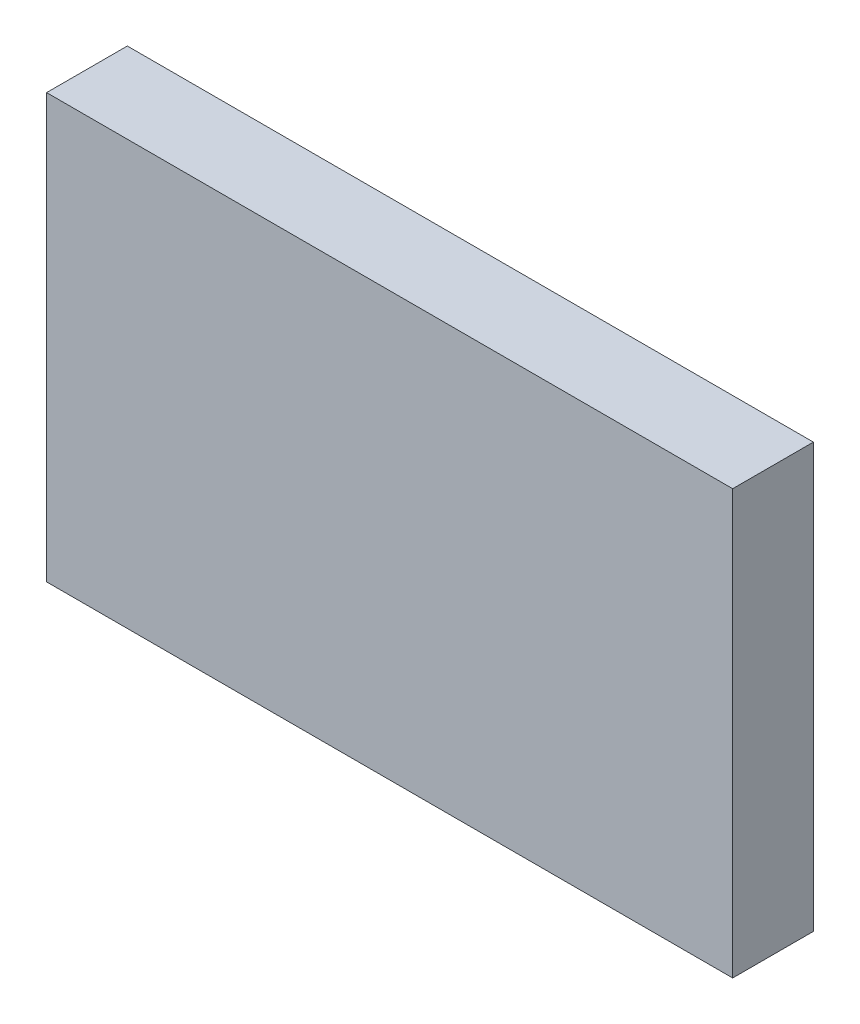
ISO-10303-21;
HEADER;
FILE_DESCRIPTION(('STEP AP214'),'2;1');
FILE_NAME('part.step','',(''),(''),'','','');
FILE_SCHEMA(('AUTOMOTIVE_DESIGN { 1 0 10303 214 1 1 1 1 }'));
ENDSEC;
DATA;
#1=APPLICATION_CONTEXT('core data for automotive mechanical design processes');
#2=APPLICATION_PROTOCOL_DEFINITION('international standard','automotive_design',2000,#1);
#3=PRODUCT_CONTEXT('',#1,'mechanical');
#4=PRODUCT('Part','Part','',(#3));
#5=PRODUCT_RELATED_PRODUCT_CATEGORY('part','',(#4));
#6=PRODUCT_DEFINITION_FORMATION('','',#4);
#7=PRODUCT_DEFINITION_CONTEXT('part definition',#1,'design');
#8=PRODUCT_DEFINITION('design','',#6,#7);
#9=PRODUCT_DEFINITION_SHAPE('','',#8);
#10=(LENGTH_UNIT() NAMED_UNIT(*) SI_UNIT(.MILLI.,.METRE.));
#11=(NAMED_UNIT(*) PLANE_ANGLE_UNIT() SI_UNIT($,.RADIAN.));
#12=(NAMED_UNIT(*) SI_UNIT($,.STERADIAN.) SOLID_ANGLE_UNIT());
#13=UNCERTAINTY_MEASURE_WITH_UNIT(LENGTH_MEASURE(1.E-05),#10,'distance_accuracy_value','');
#14=(GEOMETRIC_REPRESENTATION_CONTEXT(3) GLOBAL_UNCERTAINTY_ASSIGNED_CONTEXT((#13)) GLOBAL_UNIT_ASSIGNED_CONTEXT((#10,
#11,#12)) REPRESENTATION_CONTEXT('',''));
#15=CARTESIAN_POINT('',(0.,0.,0.));
#16=DIRECTION('',(0.,0.,1.));
#17=DIRECTION('',(1.,0.,0.));
#18=AXIS2_PLACEMENT_3D('',#15,#16,#17);
#19=CARTESIAN_POINT('',(85.,-52.5,20.));
#20=DIRECTION('',(-1.,0.,0.));
#21=DIRECTION('',(0.,0.,1.));
#22=AXIS2_PLACEMENT_3D('',#19,#20,#21);
#23=PLANE('',#22);
#24=DIRECTION('',(0.,1.,0.));
#25=VECTOR('',#24,1.);
#26=CARTESIAN_POINT('',(85.,-52.5,0.));
#27=LINE('',#26,#25);
#28=CARTESIAN_POINT('',(85.,-52.5,0.));
#29=VERTEX_POINT('',#28);
#30=CARTESIAN_POINT('',(85.,52.5,0.));
#31=VERTEX_POINT('',#30);
#32=EDGE_CURVE('E95',#29,#31,#27,.T.);
#33=ORIENTED_EDGE('',*,*,#32,.T.);
#34=DIRECTION('',(0.,0.,-1.));
#35=VECTOR('',#34,1.);
#36=CARTESIAN_POINT('',(85.,52.5,20.));
#37=LINE('',#36,#35);
#38=CARTESIAN_POINT('',(85.,52.5,20.));
#39=VERTEX_POINT('',#38);
#40=EDGE_CURVE('E11',#39,#31,#37,.T.);
#41=ORIENTED_EDGE('',*,*,#40,.F.);
#42=DIRECTION('',(0.,1.,0.));
#43=VECTOR('',#42,1.);
#44=CARTESIAN_POINT('',(85.,-52.5,20.));
#45=LINE('',#44,#43);
#46=CARTESIAN_POINT('',(85.,-52.5,20.));
#47=VERTEX_POINT('',#46);
#48=EDGE_CURVE('E83',#47,#39,#45,.T.);
#49=ORIENTED_EDGE('',*,*,#48,.F.);
#50=DIRECTION('',(0.,0.,-1.));
#51=VECTOR('',#50,1.);
#52=CARTESIAN_POINT('',(85.,-52.5,20.));
#53=LINE('',#52,#51);
#54=EDGE_CURVE('E91',#47,#29,#53,.T.);
#55=ORIENTED_EDGE('',*,*,#54,.T.);
#56=EDGE_LOOP('',(#33,#41,#49,#55));
#57=FACE_BOUND('',#56,.T.);
#58=ADVANCED_FACE('F32',(#57),#23,.F.);
#59=CARTESIAN_POINT('',(-85.,52.5,20.));
#60=DIRECTION('',(0.,-1.,0.));
#61=DIRECTION('',(0.,0.,-1.));
#62=AXIS2_PLACEMENT_3D('',#59,#60,#61);
#63=PLANE('',#62);
#64=DIRECTION('',(-1.,0.,0.));
#65=VECTOR('',#64,1.);
#66=CARTESIAN_POINT('',(-85.,52.5,0.));
#67=LINE('',#66,#65);
#68=CARTESIAN_POINT('',(-85.,52.5,0.));
#69=VERTEX_POINT('',#68);
#70=EDGE_CURVE('E87',#31,#69,#67,.T.);
#71=ORIENTED_EDGE('',*,*,#70,.T.);
#72=DIRECTION('',(0.,0.,-1.));
#73=VECTOR('',#72,1.);
#74=CARTESIAN_POINT('',(-85.,52.5,20.));
#75=LINE('',#74,#73);
#76=CARTESIAN_POINT('',(-85.,52.5,20.));
#77=VERTEX_POINT('',#76);
#78=EDGE_CURVE('E40',#77,#69,#75,.T.);
#79=ORIENTED_EDGE('',*,*,#78,.F.);
#80=DIRECTION('',(-1.,0.,0.));
#81=VECTOR('',#80,1.);
#82=CARTESIAN_POINT('',(-85.,52.5,20.));
#83=LINE('',#82,#81);
#84=EDGE_CURVE('E78',#39,#77,#83,.T.);
#85=ORIENTED_EDGE('',*,*,#84,.F.);
#86=ORIENTED_EDGE('',*,*,#40,.T.);
#87=EDGE_LOOP('',(#71,#79,#85,#86));
#88=FACE_BOUND('',#87,.T.);
#89=ADVANCED_FACE('F86',(#88),#63,.F.);
#90=CARTESIAN_POINT('',(-85.,-52.5,20.));
#91=DIRECTION('',(1.,0.,0.));
#92=DIRECTION('',(0.,0.,-1.));
#93=AXIS2_PLACEMENT_3D('',#90,#91,#92);
#94=PLANE('',#93);
#95=DIRECTION('',(0.,-1.,0.));
#96=VECTOR('',#95,1.);
#97=CARTESIAN_POINT('',(-85.,-52.5,0.));
#98=LINE('',#97,#96);
#99=CARTESIAN_POINT('',(-85.,-52.5,0.));
#100=VERTEX_POINT('',#99);
#101=EDGE_CURVE('E65',#69,#100,#98,.T.);
#102=ORIENTED_EDGE('',*,*,#101,.T.);
#103=DIRECTION('',(0.,0.,-1.));
#104=VECTOR('',#103,1.);
#105=CARTESIAN_POINT('',(-85.,-52.5,20.));
#106=LINE('',#105,#104);
#107=CARTESIAN_POINT('',(-85.,-52.5,20.));
#108=VERTEX_POINT('',#107);
#109=EDGE_CURVE('E88',#108,#100,#106,.T.);
#110=ORIENTED_EDGE('',*,*,#109,.F.);
#111=DIRECTION('',(0.,-1.,0.));
#112=VECTOR('',#111,1.);
#113=CARTESIAN_POINT('',(-85.,-52.5,20.));
#114=LINE('',#113,#112);
#115=EDGE_CURVE('E81',#77,#108,#114,.T.);
#116=ORIENTED_EDGE('',*,*,#115,.F.);
#117=ORIENTED_EDGE('',*,*,#78,.T.);
#118=EDGE_LOOP('',(#102,#110,#116,#117));
#119=FACE_BOUND('',#118,.T.);
#120=ADVANCED_FACE('F89',(#119),#94,.F.);
#121=CARTESIAN_POINT('',(-85.,-52.5,20.));
#122=DIRECTION('',(0.,1.,0.));
#123=DIRECTION('',(0.,0.,1.));
#124=AXIS2_PLACEMENT_3D('',#121,#122,#123);
#125=PLANE('',#124);
#126=DIRECTION('',(1.,0.,0.));
#127=VECTOR('',#126,1.);
#128=CARTESIAN_POINT('',(-85.,-52.5,0.));
#129=LINE('',#128,#127);
#130=EDGE_CURVE('E71',#100,#29,#129,.T.);
#131=ORIENTED_EDGE('',*,*,#130,.T.);
#132=ORIENTED_EDGE('',*,*,#54,.F.);
#133=DIRECTION('',(1.,0.,0.));
#134=VECTOR('',#133,1.);
#135=CARTESIAN_POINT('',(-85.,-52.5,20.));
#136=LINE('',#135,#134);
#137=EDGE_CURVE('E48',#108,#47,#136,.T.);
#138=ORIENTED_EDGE('',*,*,#137,.F.);
#139=ORIENTED_EDGE('',*,*,#109,.T.);
#140=EDGE_LOOP('',(#131,#132,#138,#139));
#141=FACE_BOUND('',#140,.T.);
#142=ADVANCED_FACE('F102',(#141),#125,.F.);
#143=CARTESIAN_POINT('',(0.,0.,20.));
#144=DIRECTION('',(0.,0.,-1.));
#145=DIRECTION('',(-1.,0.,0.));
#146=AXIS2_PLACEMENT_3D('',#143,#144,#145);
#147=PLANE('',#146);
#148=ORIENTED_EDGE('',*,*,#48,.T.);
#149=ORIENTED_EDGE('',*,*,#84,.T.);
#150=ORIENTED_EDGE('',*,*,#115,.T.);
#151=ORIENTED_EDGE('',*,*,#137,.T.);
#152=EDGE_LOOP('',(#148,#149,#150,#151));
#153=FACE_BOUND('',#152,.T.);
#154=ADVANCED_FACE('F79',(#153),#147,.F.);
#155=CARTESIAN_POINT('',(0.,0.,0.));
#156=DIRECTION('',(0.,0.,-1.));
#157=DIRECTION('',(-1.,0.,0.));
#158=AXIS2_PLACEMENT_3D('',#155,#156,#157);
#159=PLANE('',#158);
#160=ORIENTED_EDGE('',*,*,#32,.F.);
#161=ORIENTED_EDGE('',*,*,#130,.F.);
#162=ORIENTED_EDGE('',*,*,#101,.F.);
#163=ORIENTED_EDGE('',*,*,#70,.F.);
#164=EDGE_LOOP('',(#160,#161,#162,#163));
#165=FACE_BOUND('',#164,.T.);
#166=ADVANCED_FACE('F105',(#165),#159,.T.);
#167=CLOSED_SHELL('',(#58,#89,#120,#142,#154,#166));
#168=MANIFOLD_SOLID_BREP('B2',#167);
#169=ADVANCED_BREP_SHAPE_REPRESENTATION('',(#18,#168),#14);
#170=SHAPE_DEFINITION_REPRESENTATION(#9,#169);
ENDSEC;
END-ISO-10303-21;
